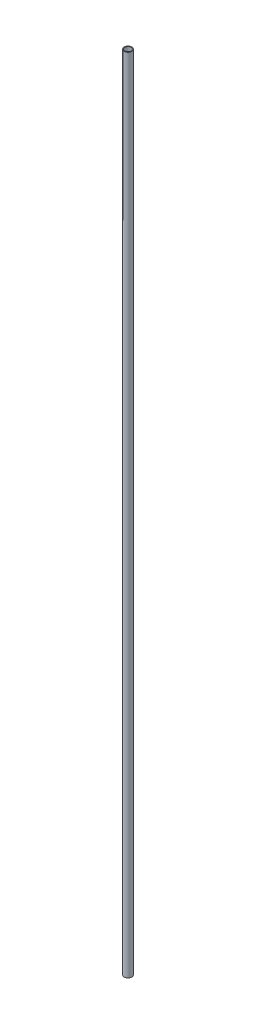
ISO-10303-21;
HEADER;
FILE_DESCRIPTION(('STEP AP214'),'2;1');
FILE_NAME('part.step','',(''),(''),'','','');
FILE_SCHEMA(('AUTOMOTIVE_DESIGN { 1 0 10303 214 1 1 1 1 }'));
ENDSEC;
DATA;
#1=APPLICATION_CONTEXT('core data for automotive mechanical design processes');
#2=APPLICATION_PROTOCOL_DEFINITION('international standard','automotive_design',2000,#1);
#3=PRODUCT_CONTEXT('',#1,'mechanical');
#4=PRODUCT('Part','Part','',(#3));
#5=PRODUCT_RELATED_PRODUCT_CATEGORY('part','',(#4));
#6=PRODUCT_DEFINITION_FORMATION('','',#4);
#7=PRODUCT_DEFINITION_CONTEXT('part definition',#1,'design');
#8=PRODUCT_DEFINITION('design','',#6,#7);
#9=PRODUCT_DEFINITION_SHAPE('','',#8);
#10=(LENGTH_UNIT() NAMED_UNIT(*) SI_UNIT(.MILLI.,.METRE.));
#11=(NAMED_UNIT(*) PLANE_ANGLE_UNIT() SI_UNIT($,.RADIAN.));
#12=(NAMED_UNIT(*) SI_UNIT($,.STERADIAN.) SOLID_ANGLE_UNIT());
#13=UNCERTAINTY_MEASURE_WITH_UNIT(LENGTH_MEASURE(1.E-05),#10,'distance_accuracy_value','');
#14=(GEOMETRIC_REPRESENTATION_CONTEXT(3) GLOBAL_UNCERTAINTY_ASSIGNED_CONTEXT((#13)) GLOBAL_UNIT_ASSIGNED_CONTEXT((#10,
#11,#12)) REPRESENTATION_CONTEXT('',''));
#15=CARTESIAN_POINT('',(0.,0.,0.));
#16=DIRECTION('',(0.,0.,1.));
#17=DIRECTION('',(1.,0.,0.));
#18=AXIS2_PLACEMENT_3D('',#15,#16,#17);
#19=CARTESIAN_POINT('',(0.,1320.8,0.));
#20=DIRECTION('',(0.,1.,0.));
#21=DIRECTION('',(0.,0.,1.));
#22=AXIS2_PLACEMENT_3D('',#19,#20,#21);
#23=PLANE('',#22);
#24=CARTESIAN_POINT('',(0.,1320.8,0.));
#25=DIRECTION('',(0.,1.,0.));
#26=DIRECTION('',(0.,0.,1.));
#27=AXIS2_PLACEMENT_3D('',#24,#25,#26);
#28=CIRCLE('',#27,6.35);
#29=CARTESIAN_POINT('',(0.,1320.8,6.35));
#30=VERTEX_POINT('',#29);
#31=EDGE_CURVE('E10',#30,#30,#28,.T.);
#32=ORIENTED_EDGE('',*,*,#31,.T.);
#33=EDGE_LOOP('',(#32));
#34=FACE_BOUND('',#33,.T.);
#35=CARTESIAN_POINT('',(0.,1320.8,0.));
#36=DIRECTION('',(0.,1.,0.));
#37=DIRECTION('',(0.,0.,1.));
#38=AXIS2_PLACEMENT_3D('',#35,#36,#37);
#39=CIRCLE('',#38,5.1054);
#40=CARTESIAN_POINT('',(0.,1320.8,5.1054));
#41=VERTEX_POINT('',#40);
#42=EDGE_CURVE('E50',#41,#41,#39,.T.);
#43=ORIENTED_EDGE('',*,*,#42,.F.);
#44=EDGE_LOOP('',(#43));
#45=FACE_BOUND('',#44,.T.);
#46=ADVANCED_FACE('F39',(#34,#45),#23,.T.);
#47=CARTESIAN_POINT('',(0.,0.,0.));
#48=DIRECTION('',(0.,1.,0.));
#49=DIRECTION('',(0.,0.,1.));
#50=AXIS2_PLACEMENT_3D('',#47,#48,#49);
#51=PLANE('',#50);
#52=CARTESIAN_POINT('',(0.,0.,0.));
#53=DIRECTION('',(0.,1.,0.));
#54=DIRECTION('',(0.,0.,1.));
#55=AXIS2_PLACEMENT_3D('',#52,#53,#54);
#56=CIRCLE('',#55,6.35);
#57=CARTESIAN_POINT('',(0.,0.,6.35));
#58=VERTEX_POINT('',#57);
#59=EDGE_CURVE('E43',#58,#58,#56,.T.);
#60=ORIENTED_EDGE('',*,*,#59,.F.);
#61=EDGE_LOOP('',(#60));
#62=FACE_BOUND('',#61,.T.);
#63=CARTESIAN_POINT('',(0.,0.,0.));
#64=DIRECTION('',(0.,1.,0.));
#65=DIRECTION('',(0.,0.,1.));
#66=AXIS2_PLACEMENT_3D('',#63,#64,#65);
#67=CIRCLE('',#66,5.1054);
#68=CARTESIAN_POINT('',(0.,0.,5.1054));
#69=VERTEX_POINT('',#68);
#70=EDGE_CURVE('E52',#69,#69,#67,.T.);
#71=ORIENTED_EDGE('',*,*,#70,.T.);
#72=EDGE_LOOP('',(#71));
#73=FACE_BOUND('',#72,.T.);
#74=ADVANCED_FACE('F62',(#62,#73),#51,.F.);
#75=CARTESIAN_POINT('',(0.,1320.8,0.));
#76=DIRECTION('',(0.,-1.,0.));
#77=DIRECTION('',(0.,0.,-1.));
#78=AXIS2_PLACEMENT_3D('',#75,#76,#77);
#79=CYLINDRICAL_SURFACE('',#78,6.35);
#80=ORIENTED_EDGE('',*,*,#31,.F.);
#81=EDGE_LOOP('',(#80));
#82=FACE_BOUND('',#81,.T.);
#83=ORIENTED_EDGE('',*,*,#59,.T.);
#84=EDGE_LOOP('',(#83));
#85=FACE_BOUND('',#84,.T.);
#86=ADVANCED_FACE('F41',(#82,#85),#79,.T.);
#87=CARTESIAN_POINT('',(0.,1320.8,0.));
#88=DIRECTION('',(0.,-1.,0.));
#89=DIRECTION('',(0.,0.,-1.));
#90=AXIS2_PLACEMENT_3D('',#87,#88,#89);
#91=CYLINDRICAL_SURFACE('',#90,5.1054);
#92=ORIENTED_EDGE('',*,*,#42,.T.);
#93=EDGE_LOOP('',(#92));
#94=FACE_BOUND('',#93,.T.);
#95=ORIENTED_EDGE('',*,*,#70,.F.);
#96=EDGE_LOOP('',(#95));
#97=FACE_BOUND('',#96,.T.);
#98=ADVANCED_FACE('F58',(#94,#97),#91,.F.);
#99=CLOSED_SHELL('',(#46,#74,#86,#98));
#100=MANIFOLD_SOLID_BREP('B2',#99);
#101=ADVANCED_BREP_SHAPE_REPRESENTATION('',(#18,#100),#14);
#102=SHAPE_DEFINITION_REPRESENTATION(#9,#101);
ENDSEC;
END-ISO-10303-21;
